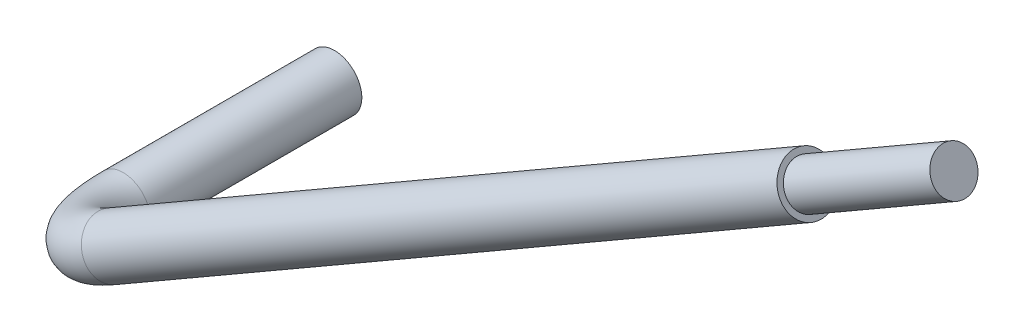
ISO-10303-21;
HEADER;
FILE_DESCRIPTION(('STEP AP214'),'2;1');
FILE_NAME('part.step','',(''),(''),'','','');
FILE_SCHEMA(('AUTOMOTIVE_DESIGN { 1 0 10303 214 1 1 1 1 }'));
ENDSEC;
DATA;
#1=APPLICATION_CONTEXT('core data for automotive mechanical design processes');
#2=APPLICATION_PROTOCOL_DEFINITION('international standard','automotive_design',2000,#1);
#3=PRODUCT_CONTEXT('',#1,'mechanical');
#4=PRODUCT('Part','Part','',(#3));
#5=PRODUCT_RELATED_PRODUCT_CATEGORY('part','',(#4));
#6=PRODUCT_DEFINITION_FORMATION('','',#4);
#7=PRODUCT_DEFINITION_CONTEXT('part definition',#1,'design');
#8=PRODUCT_DEFINITION('design','',#6,#7);
#9=PRODUCT_DEFINITION_SHAPE('','',#8);
#10=(LENGTH_UNIT() NAMED_UNIT(*) SI_UNIT(.MILLI.,.METRE.));
#11=(NAMED_UNIT(*) PLANE_ANGLE_UNIT() SI_UNIT($,.RADIAN.));
#12=(NAMED_UNIT(*) SI_UNIT($,.STERADIAN.) SOLID_ANGLE_UNIT());
#13=UNCERTAINTY_MEASURE_WITH_UNIT(LENGTH_MEASURE(1.E-05),#10,'distance_accuracy_value','');
#14=(GEOMETRIC_REPRESENTATION_CONTEXT(3) GLOBAL_UNCERTAINTY_ASSIGNED_CONTEXT((#13)) GLOBAL_UNIT_ASSIGNED_CONTEXT((#10,
#11,#12)) REPRESENTATION_CONTEXT('',''));
#15=CARTESIAN_POINT('',(0.,0.,0.));
#16=DIRECTION('',(0.,0.,1.));
#17=DIRECTION('',(1.,0.,0.));
#18=AXIS2_PLACEMENT_3D('',#15,#16,#17);
#19=CARTESIAN_POINT('',(10.7019948689,5.752560049127,6.85));
#20=DIRECTION('',(-0.500000000000017,0.866025403784429,0.));
#21=DIRECTION('',(-0.866025403784429,-0.500000000000017,0.));
#22=AXIS2_PLACEMENT_3D('',#19,#20,#21);
#23=TOROIDAL_SURFACE('',#22,2.,0.645);
#24=CARTESIAN_POINT('',(8.969944061327,4.752560049127,6.85));
#25=DIRECTION('',(0.,0.,1.));
#26=DIRECTION('',(0.866025403784429,0.500000000000017,0.));
#27=AXIS2_PLACEMENT_3D('',#24,#25,#26);
#28=CIRCLE('',#27,0.645);
#29=CARTESIAN_POINT('',(8.4113576758888,4.43006004912936,6.85));
#30=VERTEX_POINT('',#29);
#31=EDGE_CURVE('E10',#30,#30,#28,.T.);
#32=CARTESIAN_POINT('',(10.7019948689,5.752560049127,8.85));
#33=DIRECTION('',(-0.866025403784429,-0.500000000000017,0.));
#34=DIRECTION('',(0.,0.,1.));
#35=AXIS2_PLACEMENT_3D('',#32,#33,#34);
#36=CIRCLE('',#35,0.645);
#37=CARTESIAN_POINT('',(10.7019948689,5.752560049127,9.495));
#38=VERTEX_POINT('',#37);
#39=EDGE_CURVE('E30',#38,#38,#36,.T.);
#40=CARTESIAN_POINT('',(10.7019948689,5.752560049127,6.85));
#41=DIRECTION('',(-0.500000000000017,0.866025403784429,0.));
#42=DIRECTION('',(-0.866025403784429,-0.500000000000017,0.));
#43=AXIS2_PLACEMENT_3D('',#40,#41,#42);
#44=CIRCLE('',#43,2.645);
#45=EDGE_CURVE('',#30,#38,#44,.T.);
#46=ORIENTED_EDGE('',*,*,#31,.T.);
#47=ORIENTED_EDGE('',*,*,#39,.T.);
#48=ORIENTED_EDGE('',*,*,#45,.T.);
#49=ORIENTED_EDGE('',*,*,#45,.F.);
#50=EDGE_LOOP('',(#46,#48,#47,#49));
#51=FACE_BOUND('',#50,.T.);
#52=ADVANCED_FACE('F14',(#51),#23,.T.);
#53=CARTESIAN_POINT('',(8.969944061327,4.752560049127,6.85));
#54=DIRECTION('',(0.,0.,-1.));
#55=DIRECTION('',(-1.,0.,0.));
#56=AXIS2_PLACEMENT_3D('',#53,#54,#55);
#57=CYLINDRICAL_SURFACE('',#56,0.645);
#58=CARTESIAN_POINT('',(8.969944061327,4.752560049127,1.85));
#59=DIRECTION('',(0.,0.,-1.));
#60=DIRECTION('',(-1.,0.,0.));
#61=AXIS2_PLACEMENT_3D('',#58,#59,#60);
#62=CIRCLE('',#61,0.645);
#63=CARTESIAN_POINT('',(8.324944061327,4.752560049127,1.85));
#64=VERTEX_POINT('',#63);
#65=EDGE_CURVE('E21',#64,#64,#62,.T.);
#66=ORIENTED_EDGE('',*,*,#65,.F.);
#67=EDGE_LOOP('',(#66));
#68=FACE_BOUND('',#67,.T.);
#69=ORIENTED_EDGE('',*,*,#31,.F.);
#70=EDGE_LOOP('',(#69));
#71=FACE_BOUND('',#70,.T.);
#72=ADVANCED_FACE('F72',(#68,#71),#57,.T.);
#73=CARTESIAN_POINT('',(1.472243186434,-0.5,1.85));
#74=DIRECTION('',(0.,0.,1.));
#75=DIRECTION('',(1.,0.,0.));
#76=AXIS2_PLACEMENT_3D('',#73,#74,#75);
#77=PLANE('',#76);
#78=ORIENTED_EDGE('',*,*,#65,.T.);
#79=EDGE_LOOP('',(#78));
#80=FACE_BOUND('',#79,.T.);
#81=ADVANCED_FACE('F77',(#80),#77,.F.);
#82=CARTESIAN_POINT('',(10.7019948689,5.752560049127,8.85));
#83=DIRECTION('',(0.866025403784429,0.500000000000017,0.));
#84=DIRECTION('',(-0.500000000000017,0.866025403784429,0.));
#85=AXIS2_PLACEMENT_3D('',#82,#83,#84);
#86=CYLINDRICAL_SURFACE('',#85,0.645);
#87=CARTESIAN_POINT('',(27.1564775408,15.25256004913,8.85));
#88=DIRECTION('',(0.866025403784429,0.500000000000017,0.));
#89=DIRECTION('',(-0.500000000000017,0.866025403784429,0.));
#90=AXIS2_PLACEMENT_3D('',#87,#88,#89);
#91=CIRCLE('',#90,0.645);
#92=CARTESIAN_POINT('',(26.8339775408,15.811146434571,8.85));
#93=VERTEX_POINT('',#92);
#94=EDGE_CURVE('E37',#93,#93,#91,.T.);
#95=ORIENTED_EDGE('',*,*,#94,.F.);
#96=EDGE_LOOP('',(#95));
#97=FACE_BOUND('',#96,.T.);
#98=ORIENTED_EDGE('',*,*,#39,.F.);
#99=EDGE_LOOP('',(#98));
#100=FACE_BOUND('',#99,.T.);
#101=ADVANCED_FACE('F67',(#97,#100),#86,.T.);
#102=CARTESIAN_POINT('',(27.1564775408,15.25256004913,8.85));
#103=DIRECTION('',(0.866025403784429,0.500000000000017,0.));
#104=DIRECTION('',(0.,0.,-1.));
#105=AXIS2_PLACEMENT_3D('',#102,#103,#104);
#106=PLANE('',#105);
#107=ORIENTED_EDGE('',*,*,#94,.T.);
#108=EDGE_LOOP('',(#107));
#109=FACE_BOUND('',#108,.T.);
#110=CARTESIAN_POINT('',(27.1564775408,15.25256004913,8.85));
#111=DIRECTION('',(-0.866025403784429,-0.500000000000017,0.));
#112=DIRECTION('',(-0.500000000000017,0.866025403784429,0.));
#113=AXIS2_PLACEMENT_3D('',#110,#111,#112);
#114=CIRCLE('',#113,0.51);
#115=CARTESIAN_POINT('',(26.9014775408,15.6942330050601,8.85));
#116=VERTEX_POINT('',#115);
#117=EDGE_CURVE('E43',#116,#116,#114,.T.);
#118=ORIENTED_EDGE('',*,*,#117,.T.);
#119=EDGE_LOOP('',(#118));
#120=FACE_BOUND('',#119,.T.);
#121=ADVANCED_FACE('F58',(#109,#120),#106,.T.);
#122=CARTESIAN_POINT('',(39.28083319378,22.25256004913,8.85));
#123=DIRECTION('',(-0.866025403784429,-0.500000000000017,0.));
#124=DIRECTION('',(0.500000000000017,-0.866025403784429,0.));
#125=AXIS2_PLACEMENT_3D('',#122,#123,#124);
#126=CYLINDRICAL_SURFACE('',#125,0.51);
#127=ORIENTED_EDGE('',*,*,#117,.F.);
#128=EDGE_LOOP('',(#127));
#129=FACE_BOUND('',#128,.T.);
#130=CARTESIAN_POINT('',(30.62057915594,17.25256004913,8.85));
#131=DIRECTION('',(0.866025403784429,0.500000000000017,0.));
#132=DIRECTION('',(-0.500000000000017,0.866025403784429,0.));
#133=AXIS2_PLACEMENT_3D('',#130,#131,#132);
#134=CIRCLE('',#133,0.51);
#135=CARTESIAN_POINT('',(30.36557915594,17.6942330050601,8.85));
#136=VERTEX_POINT('',#135);
#137=EDGE_CURVE('E46',#136,#136,#134,.T.);
#138=ORIENTED_EDGE('',*,*,#137,.F.);
#139=EDGE_LOOP('',(#138));
#140=FACE_BOUND('',#139,.T.);
#141=ADVANCED_FACE('F56',(#129,#140),#126,.T.);
#142=CARTESIAN_POINT('',(30.62057915594,17.25256004913,8.85));
#143=DIRECTION('',(0.866025403784429,0.500000000000017,0.));
#144=DIRECTION('',(0.,0.,-1.));
#145=AXIS2_PLACEMENT_3D('',#142,#143,#144);
#146=PLANE('',#145);
#147=ORIENTED_EDGE('',*,*,#137,.T.);
#148=EDGE_LOOP('',(#147));
#149=FACE_BOUND('',#148,.T.);
#150=ADVANCED_FACE('F54',(#149),#146,.T.);
#151=CLOSED_SHELL('',(#52,#72,#81,#101,#121,#141,#150));
#152=MANIFOLD_SOLID_BREP('B1',#151);
#153=ADVANCED_BREP_SHAPE_REPRESENTATION('',(#18,#152),#14);
#154=SHAPE_DEFINITION_REPRESENTATION(#9,#153);
ENDSEC;
END-ISO-10303-21;
